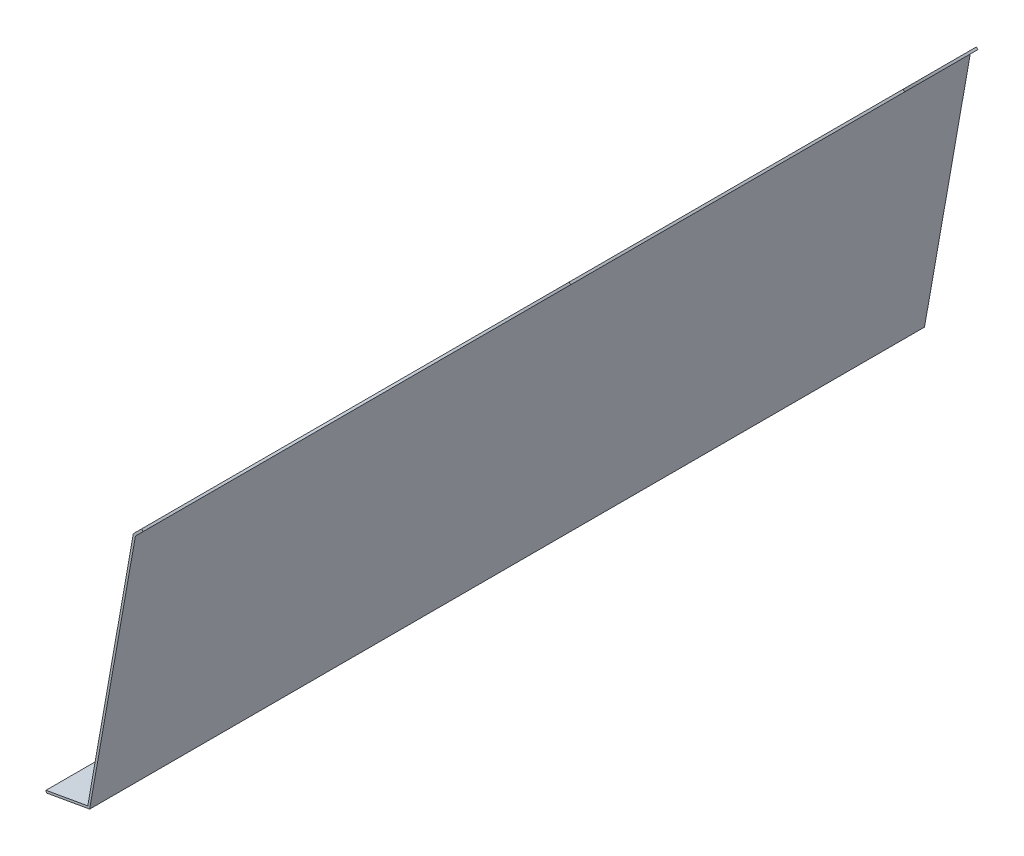
ISO-10303-21;
HEADER;
FILE_DESCRIPTION(('STEP AP214'),'2;1');
FILE_NAME('part.step','',(''),(''),'','','');
FILE_SCHEMA(('AUTOMOTIVE_DESIGN { 1 0 10303 214 1 1 1 1 }'));
ENDSEC;
DATA;
#1=APPLICATION_CONTEXT('core data for automotive mechanical design processes');
#2=APPLICATION_PROTOCOL_DEFINITION('international standard','automotive_design',2000,#1);
#3=PRODUCT_CONTEXT('',#1,'mechanical');
#4=PRODUCT('Part','Part','',(#3));
#5=PRODUCT_RELATED_PRODUCT_CATEGORY('part','',(#4));
#6=PRODUCT_DEFINITION_FORMATION('','',#4);
#7=PRODUCT_DEFINITION_CONTEXT('part definition',#1,'design');
#8=PRODUCT_DEFINITION('design','',#6,#7);
#9=PRODUCT_DEFINITION_SHAPE('','',#8);
#10=(LENGTH_UNIT() NAMED_UNIT(*) SI_UNIT(.MILLI.,.METRE.));
#11=(NAMED_UNIT(*) PLANE_ANGLE_UNIT() SI_UNIT($,.RADIAN.));
#12=(NAMED_UNIT(*) SI_UNIT($,.STERADIAN.) SOLID_ANGLE_UNIT());
#13=UNCERTAINTY_MEASURE_WITH_UNIT(LENGTH_MEASURE(1.E-05),#10,'distance_accuracy_value','');
#14=(GEOMETRIC_REPRESENTATION_CONTEXT(3) GLOBAL_UNCERTAINTY_ASSIGNED_CONTEXT((#13)) GLOBAL_UNIT_ASSIGNED_CONTEXT((#10,
#11,#12)) REPRESENTATION_CONTEXT('',''));
#15=CARTESIAN_POINT('',(0.,0.,0.));
#16=DIRECTION('',(0.,0.,1.));
#17=DIRECTION('',(1.,0.,0.));
#18=AXIS2_PLACEMENT_3D('',#15,#16,#17);
#19=CARTESIAN_POINT('',(-17.0348158316097,17.0348158316097,380.));
#20=DIRECTION('',(0.707106781186548,-0.707106781186548,0.));
#21=DIRECTION('',(0.707106781186548,0.707106781186548,0.));
#22=AXIS2_PLACEMENT_3D('',#19,#20,#21);
#23=PLANE('',#22);
#24=CARTESIAN_POINT('',(-72.5068070161094,-38.43717535289,254.5));
#25=DIRECTION('',(0.707106781186548,-0.707106781186547,0.));
#26=DIRECTION('',(0.707106781186547,0.707106781186548,0.));
#27=AXIS2_PLACEMENT_3D('',#24,#25,#26);
#28=CIRCLE('',#27,1.50000000000003);
#29=CARTESIAN_POINT('',(-71.4461468443295,-37.3765151811102,254.5));
#30=VERTEX_POINT('',#29);
#31=EDGE_CURVE('E183',#30,#30,#28,.T.);
#32=ORIENTED_EDGE('',*,*,#31,.F.);
#33=EDGE_LOOP('',(#32));
#34=FACE_BOUND('',#33,.T.);
#35=CARTESIAN_POINT('',(-80.992088390348,-46.9224567271286,254.5));
#36=DIRECTION('',(0.707106781186548,-0.707106781186547,0.));
#37=DIRECTION('',(0.707106781186547,0.707106781186548,0.));
#38=AXIS2_PLACEMENT_3D('',#35,#36,#37);
#39=CIRCLE('',#38,1.50000000000002);
#40=CARTESIAN_POINT('',(-79.9314282185681,-45.8617965553487,254.5));
#41=VERTEX_POINT('',#40);
#42=EDGE_CURVE('E173',#41,#41,#39,.T.);
#43=ORIENTED_EDGE('',*,*,#42,.F.);
#44=EDGE_LOOP('',(#43));
#45=FACE_BOUND('',#44,.T.);
#46=CARTESIAN_POINT('',(-72.5068070161094,-38.43717535289,125.5));
#47=DIRECTION('',(-0.707106781186548,0.707106781186547,0.));
#48=DIRECTION('',(-0.707106781186547,-0.707106781186548,0.));
#49=AXIS2_PLACEMENT_3D('',#46,#47,#48);
#50=CIRCLE('',#49,1.50000000000003);
#51=CARTESIAN_POINT('',(-73.5674671878892,-39.4978355246698,125.5));
#52=VERTEX_POINT('',#51);
#53=EDGE_CURVE('E167',#52,#52,#50,.T.);
#54=ORIENTED_EDGE('',*,*,#53,.T.);
#55=EDGE_LOOP('',(#54));
#56=FACE_BOUND('',#55,.T.);
#57=CARTESIAN_POINT('',(-44.2225357686475,-10.1529041054281,125.5));
#58=DIRECTION('',(-0.707106781186548,0.707106781186547,0.));
#59=DIRECTION('',(-0.707106781186547,-0.707106781186548,0.));
#60=AXIS2_PLACEMENT_3D('',#57,#58,#59);
#61=CIRCLE('',#60,1.50000000000002);
#62=CARTESIAN_POINT('',(-45.2831959404273,-11.2135642772079,125.5));
#63=VERTEX_POINT('',#62);
#64=EDGE_CURVE('E159',#63,#63,#61,.T.);
#65=ORIENTED_EDGE('',*,*,#64,.T.);
#66=EDGE_LOOP('',(#65));
#67=FACE_BOUND('',#66,.T.);
#68=CARTESIAN_POINT('',(-44.2225357686474,-10.1529041054281,254.5));
#69=DIRECTION('',(0.707106781186548,-0.707106781186547,0.));
#70=DIRECTION('',(0.707106781186547,0.707106781186548,0.));
#71=AXIS2_PLACEMENT_3D('',#68,#69,#70);
#72=CIRCLE('',#71,1.50000000000002);
#73=CARTESIAN_POINT('',(-43.1618755968676,-9.09224393364823,254.5));
#74=VERTEX_POINT('',#73);
#75=EDGE_CURVE('E151',#74,#74,#72,.T.);
#76=ORIENTED_EDGE('',*,*,#75,.F.);
#77=EDGE_LOOP('',(#76));
#78=FACE_BOUND('',#77,.T.);
#79=CARTESIAN_POINT('',(-52.7078171428861,-18.6381854796667,254.5));
#80=DIRECTION('',(0.707106781186548,-0.707106781186547,0.));
#81=DIRECTION('',(0.707106781186547,0.707106781186548,0.));
#82=AXIS2_PLACEMENT_3D('',#79,#80,#81);
#83=CIRCLE('',#82,1.50000000000002);
#84=CARTESIAN_POINT('',(-51.6471569711062,-17.5775253078868,254.5));
#85=VERTEX_POINT('',#84);
#86=EDGE_CURVE('E155',#85,#85,#83,.T.);
#87=ORIENTED_EDGE('',*,*,#86,.F.);
#88=EDGE_LOOP('',(#87));
#89=FACE_BOUND('',#88,.T.);
#90=DIRECTION('',(-0.707106781186548,-0.707106781186548,0.));
#91=VECTOR('',#90,1.);
#92=CARTESIAN_POINT('',(-17.0348158316097,17.0348158316097,0.));
#93=LINE('',#92,#91);
#94=CARTESIAN_POINT('',(-107.862146075437,-73.7925144122173,0.));
#95=VERTEX_POINT('',#94);
#96=CARTESIAN_POINT('',(-111.394108643907,-77.3244769806876,0.));
#97=VERTEX_POINT('',#96);
#98=EDGE_CURVE('E127',#95,#97,#93,.T.);
#99=ORIENTED_EDGE('',*,*,#98,.F.);
#100=CARTESIAN_POINT('',(-27.2519730201704,6.81765864304912,0.));
#101=DIRECTION('',(0.707106781186548,-0.707106781186547,0.));
#102=DIRECTION('',(0.707106781186547,0.707106781186548,0.));
#103=AXIS2_PLACEMENT_3D('',#100,#101,#102);
#104=CIRCLE('',#103,114.);
#105=CARTESIAN_POINT('',(-27.2519730201703,6.81765864304905,114.));
#106=VERTEX_POINT('',#105);
#107=EDGE_CURVE('E50',#95,#106,#104,.F.);
#108=ORIENTED_EDGE('',*,*,#107,.T.);
#109=DIRECTION('',(0.,0.,-1.));
#110=VECTOR('',#109,1.);
#111=CARTESIAN_POINT('',(-27.2519730201703,6.81765864304905,380.));
#112=LINE('',#111,#110);
#113=CARTESIAN_POINT('',(-27.2519730201703,6.81765864304905,266.));
#114=VERTEX_POINT('',#113);
#115=EDGE_CURVE('E125',#114,#106,#112,.T.);
#116=ORIENTED_EDGE('',*,*,#115,.F.);
#117=CARTESIAN_POINT('',(-27.2519730201704,6.81765864304912,380.));
#118=DIRECTION('',(0.707106781186548,-0.707106781186547,0.));
#119=DIRECTION('',(0.707106781186547,0.707106781186548,0.));
#120=AXIS2_PLACEMENT_3D('',#117,#118,#119);
#121=CIRCLE('',#120,114.);
#122=CARTESIAN_POINT('',(-107.862146075437,-73.7925144122174,380.));
#123=VERTEX_POINT('',#122);
#124=EDGE_CURVE('E194',#123,#114,#121,.T.);
#125=ORIENTED_EDGE('',*,*,#124,.F.);
#126=DIRECTION('',(-0.707106781186548,-0.707106781186548,0.));
#127=VECTOR('',#126,1.);
#128=CARTESIAN_POINT('',(-17.0348158316097,17.0348158316097,380.));
#129=LINE('',#128,#127);
#130=CARTESIAN_POINT('',(-111.394108643907,-77.3244769806876,380.));
#131=VERTEX_POINT('',#130);
#132=EDGE_CURVE('E213',#123,#131,#129,.T.);
#133=ORIENTED_EDGE('',*,*,#132,.T.);
#134=DIRECTION('',(0.,0.,-1.));
#135=VECTOR('',#134,1.);
#136=CARTESIAN_POINT('',(-111.394108643907,-77.3244769806876,380.));
#137=LINE('',#136,#135);
#138=EDGE_CURVE('E132',#131,#97,#137,.T.);
#139=ORIENTED_EDGE('',*,*,#138,.T.);
#140=EDGE_LOOP('',(#99,#108,#116,#125,#133,#139));
#141=FACE_BOUND('',#140,.T.);
#142=CARTESIAN_POINT('',(-52.7078171428861,-18.6381854796666,125.5));
#143=DIRECTION('',(-0.707106781186548,0.707106781186547,0.));
#144=DIRECTION('',(-0.707106781186547,-0.707106781186548,0.));
#145=AXIS2_PLACEMENT_3D('',#142,#143,#144);
#146=CIRCLE('',#145,1.50000000000002);
#147=CARTESIAN_POINT('',(-53.7684773146659,-19.6988456514465,125.5));
#148=VERTEX_POINT('',#147);
#149=EDGE_CURVE('E163',#148,#148,#146,.T.);
#150=ORIENTED_EDGE('',*,*,#149,.T.);
#151=EDGE_LOOP('',(#150));
#152=FACE_BOUND('',#151,.T.);
#153=CARTESIAN_POINT('',(-80.9920883903479,-46.9224567271286,125.5));
#154=DIRECTION('',(-0.707106781186548,0.707106781186547,0.));
#155=DIRECTION('',(-0.707106781186547,-0.707106781186548,0.));
#156=AXIS2_PLACEMENT_3D('',#153,#154,#155);
#157=CIRCLE('',#156,1.50000000000003);
#158=CARTESIAN_POINT('',(-82.0527485621278,-47.9831168989084,125.5));
#159=VERTEX_POINT('',#158);
#160=EDGE_CURVE('E170',#159,#159,#157,.T.);
#161=ORIENTED_EDGE('',*,*,#160,.T.);
#162=EDGE_LOOP('',(#161));
#163=FACE_BOUND('',#162,.T.);
#164=ADVANCED_FACE('F34',(#34,#45,#56,#67,#78,#89,#141,#152,#163),#23,.T.);
#165=CARTESIAN_POINT('',(-17.7419226127962,17.7419226127962,380.));
#166=DIRECTION('',(0.707106781186548,-0.707106781186548,0.));
#167=DIRECTION('',(0.707106781186548,0.707106781186548,0.));
#168=AXIS2_PLACEMENT_3D('',#165,#166,#167);
#169=PLANE('',#168);
#170=CARTESIAN_POINT('',(-73.2139137972959,-37.7300685717034,254.5));
#171=DIRECTION('',(0.707106781186548,-0.707106781186548,0.));
#172=DIRECTION('',(0.707106781186548,0.707106781186548,0.));
#173=AXIS2_PLACEMENT_3D('',#170,#171,#172);
#174=CIRCLE('',#173,1.50000000000003);
#175=CARTESIAN_POINT('',(-72.1532536255161,-36.6694083999236,254.5));
#176=VERTEX_POINT('',#175);
#177=EDGE_CURVE('E38',#176,#176,#174,.T.);
#178=ORIENTED_EDGE('',*,*,#177,.T.);
#179=EDGE_LOOP('',(#178));
#180=FACE_BOUND('',#179,.T.);
#181=CARTESIAN_POINT('',(-81.6991951715345,-46.215349945942,254.5));
#182=DIRECTION('',(0.707106781186548,-0.707106781186548,0.));
#183=DIRECTION('',(0.707106781186548,0.707106781186548,0.));
#184=AXIS2_PLACEMENT_3D('',#181,#182,#183);
#185=CIRCLE('',#184,1.50000000000002);
#186=CARTESIAN_POINT('',(-80.6385349997547,-45.1546897741622,254.5));
#187=VERTEX_POINT('',#186);
#188=EDGE_CURVE('E171',#187,#187,#185,.T.);
#189=ORIENTED_EDGE('',*,*,#188,.T.);
#190=EDGE_LOOP('',(#189));
#191=FACE_BOUND('',#190,.T.);
#192=CARTESIAN_POINT('',(-73.2139137972959,-37.7300685717034,125.5));
#193=DIRECTION('',(0.707106781186548,-0.707106781186548,0.));
#194=DIRECTION('',(0.707106781186548,0.707106781186548,0.));
#195=AXIS2_PLACEMENT_3D('',#192,#193,#194);
#196=CIRCLE('',#195,1.50000000000003);
#197=CARTESIAN_POINT('',(-72.1532536255161,-36.6694083999236,125.5));
#198=VERTEX_POINT('',#197);
#199=EDGE_CURVE('E164',#198,#198,#196,.F.);
#200=ORIENTED_EDGE('',*,*,#199,.F.);
#201=EDGE_LOOP('',(#200));
#202=FACE_BOUND('',#201,.T.);
#203=CARTESIAN_POINT('',(-44.929642549834,-9.44579732424153,125.5));
#204=DIRECTION('',(0.707106781186548,-0.707106781186548,0.));
#205=DIRECTION('',(0.707106781186548,0.707106781186548,0.));
#206=AXIS2_PLACEMENT_3D('',#203,#204,#205);
#207=CIRCLE('',#206,1.50000000000002);
#208=CARTESIAN_POINT('',(-43.8689823780542,-8.3851371524617,125.5));
#209=VERTEX_POINT('',#208);
#210=EDGE_CURVE('E118',#209,#209,#207,.F.);
#211=ORIENTED_EDGE('',*,*,#210,.F.);
#212=EDGE_LOOP('',(#211));
#213=FACE_BOUND('',#212,.T.);
#214=CARTESIAN_POINT('',(-44.929642549834,-9.4457973242415,254.5));
#215=DIRECTION('',(0.707106781186548,-0.707106781186548,0.));
#216=DIRECTION('',(0.707106781186548,0.707106781186548,0.));
#217=AXIS2_PLACEMENT_3D('',#214,#215,#216);
#218=CIRCLE('',#217,1.50000000000002);
#219=CARTESIAN_POINT('',(-43.8689823780542,-8.38513715246166,254.5));
#220=VERTEX_POINT('',#219);
#221=EDGE_CURVE('E147',#220,#220,#218,.T.);
#222=ORIENTED_EDGE('',*,*,#221,.T.);
#223=EDGE_LOOP('',(#222));
#224=FACE_BOUND('',#223,.T.);
#225=CARTESIAN_POINT('',(-53.4149239240726,-17.9310786984801,254.5));
#226=DIRECTION('',(0.707106781186548,-0.707106781186548,0.));
#227=DIRECTION('',(0.707106781186548,0.707106781186548,0.));
#228=AXIS2_PLACEMENT_3D('',#225,#226,#227);
#229=CIRCLE('',#228,1.50000000000002);
#230=CARTESIAN_POINT('',(-52.3542637522928,-16.8704185267003,254.5));
#231=VERTEX_POINT('',#230);
#232=EDGE_CURVE('E152',#231,#231,#229,.T.);
#233=ORIENTED_EDGE('',*,*,#232,.T.);
#234=EDGE_LOOP('',(#233));
#235=FACE_BOUND('',#234,.T.);
#236=CARTESIAN_POINT('',(-27.9590798013569,7.52476542423563,0.));
#237=DIRECTION('',(0.707106781186548,-0.707106781186548,0.));
#238=DIRECTION('',(0.707106781186548,0.707106781186548,0.));
#239=AXIS2_PLACEMENT_3D('',#236,#237,#238);
#240=CIRCLE('',#239,114.);
#241=CARTESIAN_POINT('',(-108.569252856623,-73.0854076310307,0.));
#242=VERTEX_POINT('',#241);
#243=CARTESIAN_POINT('',(-27.9590798013569,7.5247654242356,114.));
#244=VERTEX_POINT('',#243);
#245=EDGE_CURVE('E113',#242,#244,#240,.F.);
#246=ORIENTED_EDGE('',*,*,#245,.F.);
#247=DIRECTION('',(-0.707106781186548,-0.707106781186548,0.));
#248=VECTOR('',#247,1.);
#249=CARTESIAN_POINT('',(-17.7419226127962,17.7419226127962,0.));
#250=LINE('',#249,#248);
#251=CARTESIAN_POINT('',(-112.32416533681,-76.8403201112173,0.));
#252=VERTEX_POINT('',#251);
#253=EDGE_CURVE('E232',#242,#252,#250,.T.);
#254=ORIENTED_EDGE('',*,*,#253,.T.);
#255=DIRECTION('',(0.,0.,-1.));
#256=VECTOR('',#255,1.);
#257=CARTESIAN_POINT('',(-112.32416533681,-76.8403201112173,380.));
#258=LINE('',#257,#256);
#259=CARTESIAN_POINT('',(-112.32416533681,-76.8403201112173,380.));
#260=VERTEX_POINT('',#259);
#261=EDGE_CURVE('E137',#260,#252,#258,.T.);
#262=ORIENTED_EDGE('',*,*,#261,.F.);
#263=DIRECTION('',(-0.707106781186548,-0.707106781186548,0.));
#264=VECTOR('',#263,1.);
#265=CARTESIAN_POINT('',(-17.7419226127962,17.7419226127962,380.));
#266=LINE('',#265,#264);
#267=CARTESIAN_POINT('',(-108.569252856623,-73.0854076310308,380.));
#268=VERTEX_POINT('',#267);
#269=EDGE_CURVE('E215',#268,#260,#266,.T.);
#270=ORIENTED_EDGE('',*,*,#269,.F.);
#271=CARTESIAN_POINT('',(-27.9590798013569,7.52476542423563,380.));
#272=DIRECTION('',(0.707106781186548,-0.707106781186548,0.));
#273=DIRECTION('',(0.707106781186548,0.707106781186548,0.));
#274=AXIS2_PLACEMENT_3D('',#271,#272,#273);
#275=CIRCLE('',#274,114.);
#276=CARTESIAN_POINT('',(-27.9590798013569,7.5247654242356,266.));
#277=VERTEX_POINT('',#276);
#278=EDGE_CURVE('E58',#268,#277,#275,.T.);
#279=ORIENTED_EDGE('',*,*,#278,.T.);
#280=DIRECTION('',(0.,0.,-1.));
#281=VECTOR('',#280,1.);
#282=CARTESIAN_POINT('',(-27.9590798013569,7.5247654242356,380.));
#283=LINE('',#282,#281);
#284=EDGE_CURVE('E133',#277,#244,#283,.T.);
#285=ORIENTED_EDGE('',*,*,#284,.T.);
#286=EDGE_LOOP('',(#246,#254,#262,#270,#279,#285));
#287=FACE_BOUND('',#286,.T.);
#288=CARTESIAN_POINT('',(-53.4149239240726,-17.9310786984801,125.5));
#289=DIRECTION('',(0.707106781186548,-0.707106781186548,0.));
#290=DIRECTION('',(0.707106781186548,0.707106781186548,0.));
#291=AXIS2_PLACEMENT_3D('',#288,#289,#290);
#292=CIRCLE('',#291,1.50000000000002);
#293=CARTESIAN_POINT('',(-52.3542637522928,-16.8704185267003,125.5));
#294=VERTEX_POINT('',#293);
#295=EDGE_CURVE('E160',#294,#294,#292,.F.);
#296=ORIENTED_EDGE('',*,*,#295,.F.);
#297=EDGE_LOOP('',(#296));
#298=FACE_BOUND('',#297,.T.);
#299=CARTESIAN_POINT('',(-81.6991951715345,-46.215349945942,125.5));
#300=DIRECTION('',(0.707106781186548,-0.707106781186548,0.));
#301=DIRECTION('',(0.707106781186548,0.707106781186548,0.));
#302=AXIS2_PLACEMENT_3D('',#299,#300,#301);
#303=CIRCLE('',#302,1.50000000000003);
#304=CARTESIAN_POINT('',(-80.6385349997547,-45.1546897741622,125.5));
#305=VERTEX_POINT('',#304);
#306=EDGE_CURVE('E168',#305,#305,#303,.F.);
#307=ORIENTED_EDGE('',*,*,#306,.F.);
#308=EDGE_LOOP('',(#307));
#309=FACE_BOUND('',#308,.T.);
#310=ADVANCED_FACE('F257',(#180,#191,#202,#213,#224,#235,#287,#298,#309),#169,.F.);
#311=CARTESIAN_POINT('',(-10.2171571885606,-10.2171571885606,380.));
#312=DIRECTION('',(0.707106781186547,0.707106781186548,0.));
#313=DIRECTION('',(-0.707106781186548,0.707106781186547,0.));
#314=AXIS2_PLACEMENT_3D('',#311,#312,#313);
#315=PLANE('',#314);
#316=ORIENTED_EDGE('',*,*,#115,.T.);
#317=DIRECTION('',(0.707106781186548,-0.707106781186547,0.));
#318=VECTOR('',#317,1.);
#319=CARTESIAN_POINT('',(-29.37329336373,8.93897898660869,114.));
#320=LINE('',#319,#318);
#321=EDGE_CURVE('E110',#244,#106,#320,.T.);
#322=ORIENTED_EDGE('',*,*,#321,.F.);
#323=ORIENTED_EDGE('',*,*,#284,.F.);
#324=DIRECTION('',(0.707106781186548,-0.707106781186547,0.));
#325=VECTOR('',#324,1.);
#326=CARTESIAN_POINT('',(-29.37329336373,8.93897898660869,266.));
#327=LINE('',#326,#325);
#328=EDGE_CURVE('E131',#277,#114,#327,.T.);
#329=ORIENTED_EDGE('',*,*,#328,.T.);
#330=EDGE_LOOP('',(#316,#322,#323,#329));
#331=FACE_BOUND('',#330,.T.);
#332=ADVANCED_FACE('F130',(#331),#315,.T.);
#333=CARTESIAN_POINT('',(0.,0.,0.));
#334=DIRECTION('',(0.,0.,1.));
#335=DIRECTION('',(1.,0.,0.));
#336=AXIS2_PLACEMENT_3D('',#333,#334,#335);
#337=PLANE('',#336);
#338=DIRECTION('',(0.707106781186548,-0.707106781186547,0.));
#339=VECTOR('',#338,1.);
#340=CARTESIAN_POINT('',(-109.983466418996,-71.6711940686577,0.));
#341=LINE('',#340,#339);
#342=EDGE_CURVE('E11',#95,#242,#341,.F.);
#343=ORIENTED_EDGE('',*,*,#342,.F.);
#344=ORIENTED_EDGE('',*,*,#98,.T.);
#345=DIRECTION('',(-0.173648177666927,-0.984807753012209,0.));
#346=VECTOR('',#345,1.);
#347=CARTESIAN_POINT('',(-94.8119009180469,16.717896224109,0.));
#348=LINE('',#347,#346);
#349=CARTESIAN_POINT('',(-132.211708421142,-195.386952125401,0.));
#350=VERTEX_POINT('',#349);
#351=EDGE_CURVE('E228',#97,#350,#348,.T.);
#352=ORIENTED_EDGE('',*,*,#351,.T.);
#353=DIRECTION('',(-0.984807753012209,-0.173648177666925,0.));
#354=VECTOR('',#353,1.);
#355=CARTESIAN_POINT('',(29.4264658667985,-166.885780885981,0.));
#356=LINE('',#355,#354);
#357=CARTESIAN_POINT('',(-151.907863481386,-198.859915678739,0.));
#358=VERTEX_POINT('',#357);
#359=EDGE_CURVE('E225',#350,#358,#356,.T.);
#360=ORIENTED_EDGE('',*,*,#359,.T.);
#361=DIRECTION('',(0.173648177666934,-0.984807753012207,0.));
#362=VECTOR('',#361,1.);
#363=CARTESIAN_POINT('',(-181.334329348185,-31.9741347927607,0.));
#364=LINE('',#363,#362);
#365=CARTESIAN_POINT('',(-152.081511659052,-197.875107925727,0.));
#366=VERTEX_POINT('',#365);
#367=EDGE_CURVE('E222',#366,#358,#364,.T.);
#368=ORIENTED_EDGE('',*,*,#367,.F.);
#369=DIRECTION('',(-0.984807753012209,-0.173648177666924,0.));
#370=VECTOR('',#369,1.);
#371=CARTESIAN_POINT('',(29.2528176891314,-165.900973132969,0.));
#372=LINE('',#371,#370);
#373=CARTESIAN_POINT('',(-133.074926411155,-194.523734135388,0.));
#374=VERTEX_POINT('',#373);
#375=EDGE_CURVE('E150',#374,#366,#372,.T.);
#376=ORIENTED_EDGE('',*,*,#375,.F.);
#377=DIRECTION('',(-0.173648177666927,-0.984807753012209,0.));
#378=VECTOR('',#377,1.);
#379=CARTESIAN_POINT('',(-95.7967086710591,16.8915444017759,0.));
#380=LINE('',#379,#378);
#381=EDGE_CURVE('E205',#252,#374,#380,.T.);
#382=ORIENTED_EDGE('',*,*,#381,.F.);
#383=ORIENTED_EDGE('',*,*,#253,.F.);
#384=EDGE_LOOP('',(#343,#344,#352,#360,#368,#376,#382,#383));
#385=FACE_BOUND('',#384,.T.);
#386=ADVANCED_FACE('F248',(#385),#337,.F.);
#387=CARTESIAN_POINT('',(29.2528176891314,-165.900973132969,380.));
#388=DIRECTION('',(0.173648177666924,-0.984807753012209,0.));
#389=DIRECTION('',(0.984807753012209,0.173648177666924,0.));
#390=AXIS2_PLACEMENT_3D('',#387,#388,#389);
#391=PLANE('',#390);
#392=ORIENTED_EDGE('',*,*,#375,.T.);
#393=DIRECTION('',(0.,0.,-1.));
#394=VECTOR('',#393,1.);
#395=CARTESIAN_POINT('',(-152.081511659052,-197.875107925727,380.));
#396=LINE('',#395,#394);
#397=CARTESIAN_POINT('',(-152.081511659052,-197.875107925727,380.));
#398=VERTEX_POINT('',#397);
#399=EDGE_CURVE('E144',#398,#366,#396,.T.);
#400=ORIENTED_EDGE('',*,*,#399,.F.);
#401=DIRECTION('',(-0.984807753012209,-0.173648177666924,0.));
#402=VECTOR('',#401,1.);
#403=CARTESIAN_POINT('',(29.2528176891314,-165.900973132969,380.));
#404=LINE('',#403,#402);
#405=CARTESIAN_POINT('',(-133.074926411155,-194.523734135388,380.));
#406=VERTEX_POINT('',#405);
#407=EDGE_CURVE('E201',#406,#398,#404,.T.);
#408=ORIENTED_EDGE('',*,*,#407,.F.);
#409=DIRECTION('',(0.,0.,-1.));
#410=VECTOR('',#409,1.);
#411=CARTESIAN_POINT('',(-133.074926411155,-194.523734135388,380.));
#412=LINE('',#411,#410);
#413=EDGE_CURVE('E219',#406,#374,#412,.T.);
#414=ORIENTED_EDGE('',*,*,#413,.T.);
#415=EDGE_LOOP('',(#392,#400,#408,#414));
#416=FACE_BOUND('',#415,.T.);
#417=ADVANCED_FACE('F36',(#416),#391,.F.);
#418=CARTESIAN_POINT('',(-181.334329348185,-31.9741347927607,380.));
#419=DIRECTION('',(0.984807753012207,0.173648177666934,0.));
#420=DIRECTION('',(-0.173648177666934,0.984807753012207,0.));
#421=AXIS2_PLACEMENT_3D('',#418,#419,#420);
#422=PLANE('',#421);
#423=ORIENTED_EDGE('',*,*,#367,.T.);
#424=DIRECTION('',(0.,0.,-1.));
#425=VECTOR('',#424,1.);
#426=CARTESIAN_POINT('',(-151.907863481386,-198.859915678739,380.));
#427=LINE('',#426,#425);
#428=CARTESIAN_POINT('',(-151.907863481386,-198.859915678739,380.));
#429=VERTEX_POINT('',#428);
#430=EDGE_CURVE('E142',#429,#358,#427,.T.);
#431=ORIENTED_EDGE('',*,*,#430,.F.);
#432=DIRECTION('',(0.173648177666934,-0.984807753012207,0.));
#433=VECTOR('',#432,1.);
#434=CARTESIAN_POINT('',(-181.334329348185,-31.9741347927607,380.));
#435=LINE('',#434,#433);
#436=EDGE_CURVE('E204',#398,#429,#435,.T.);
#437=ORIENTED_EDGE('',*,*,#436,.F.);
#438=ORIENTED_EDGE('',*,*,#399,.T.);
#439=EDGE_LOOP('',(#423,#431,#437,#438));
#440=FACE_BOUND('',#439,.T.);
#441=ADVANCED_FACE('F297',(#440),#422,.F.);
#442=CARTESIAN_POINT('',(29.4264658667985,-166.885780885981,380.));
#443=DIRECTION('',(0.173648177666925,-0.984807753012209,0.));
#444=DIRECTION('',(0.984807753012209,0.173648177666925,0.));
#445=AXIS2_PLACEMENT_3D('',#442,#443,#444);
#446=PLANE('',#445);
#447=ORIENTED_EDGE('',*,*,#359,.F.);
#448=DIRECTION('',(0.,0.,-1.));
#449=VECTOR('',#448,1.);
#450=CARTESIAN_POINT('',(-132.211708421142,-195.386952125401,380.));
#451=LINE('',#450,#449);
#452=CARTESIAN_POINT('',(-132.211708421142,-195.386952125401,380.));
#453=VERTEX_POINT('',#452);
#454=EDGE_CURVE('E135',#453,#350,#451,.T.);
#455=ORIENTED_EDGE('',*,*,#454,.F.);
#456=DIRECTION('',(-0.984807753012209,-0.173648177666925,0.));
#457=VECTOR('',#456,1.);
#458=CARTESIAN_POINT('',(29.4264658667985,-166.885780885981,380.));
#459=LINE('',#458,#457);
#460=EDGE_CURVE('E207',#453,#429,#459,.T.);
#461=ORIENTED_EDGE('',*,*,#460,.T.);
#462=ORIENTED_EDGE('',*,*,#430,.T.);
#463=EDGE_LOOP('',(#447,#455,#461,#462));
#464=FACE_BOUND('',#463,.T.);
#465=ADVANCED_FACE('F294',(#464),#446,.T.);
#466=CARTESIAN_POINT('',(-94.8119009180469,16.717896224109,380.));
#467=DIRECTION('',(0.984807753012209,-0.173648177666927,0.));
#468=DIRECTION('',(0.173648177666927,0.984807753012209,0.));
#469=AXIS2_PLACEMENT_3D('',#466,#467,#468);
#470=PLANE('',#469);
#471=ORIENTED_EDGE('',*,*,#351,.F.);
#472=ORIENTED_EDGE('',*,*,#138,.F.);
#473=DIRECTION('',(-0.173648177666927,-0.984807753012209,0.));
#474=VECTOR('',#473,1.);
#475=CARTESIAN_POINT('',(-94.8119009180469,16.717896224109,380.));
#476=LINE('',#475,#474);
#477=EDGE_CURVE('E210',#131,#453,#476,.T.);
#478=ORIENTED_EDGE('',*,*,#477,.T.);
#479=ORIENTED_EDGE('',*,*,#454,.T.);
#480=EDGE_LOOP('',(#471,#472,#478,#479));
#481=FACE_BOUND('',#480,.T.);
#482=ADVANCED_FACE('F291',(#481),#470,.T.);
#483=CARTESIAN_POINT('',(-95.7967086710591,16.8915444017759,380.));
#484=DIRECTION('',(0.984807753012209,-0.173648177666927,0.));
#485=DIRECTION('',(0.173648177666927,0.984807753012209,0.));
#486=AXIS2_PLACEMENT_3D('',#483,#484,#485);
#487=PLANE('',#486);
#488=ORIENTED_EDGE('',*,*,#381,.T.);
#489=ORIENTED_EDGE('',*,*,#413,.F.);
#490=DIRECTION('',(-0.173648177666927,-0.984807753012209,0.));
#491=VECTOR('',#490,1.);
#492=CARTESIAN_POINT('',(-95.7967086710591,16.8915444017759,380.));
#493=LINE('',#492,#491);
#494=EDGE_CURVE('E217',#260,#406,#493,.T.);
#495=ORIENTED_EDGE('',*,*,#494,.F.);
#496=ORIENTED_EDGE('',*,*,#261,.T.);
#497=EDGE_LOOP('',(#488,#489,#495,#496));
#498=FACE_BOUND('',#497,.T.);
#499=ADVANCED_FACE('F241',(#498),#487,.F.);
#500=CARTESIAN_POINT('',(0.,0.,380.));
#501=DIRECTION('',(0.,0.,1.));
#502=DIRECTION('',(1.,0.,0.));
#503=AXIS2_PLACEMENT_3D('',#500,#501,#502);
#504=PLANE('',#503);
#505=DIRECTION('',(0.707106781186548,-0.707106781186547,0.));
#506=VECTOR('',#505,1.);
#507=CARTESIAN_POINT('',(-109.983466418996,-71.6711940686577,380.));
#508=LINE('',#507,#506);
#509=EDGE_CURVE('E43',#268,#123,#508,.T.);
#510=ORIENTED_EDGE('',*,*,#509,.F.);
#511=ORIENTED_EDGE('',*,*,#269,.T.);
#512=ORIENTED_EDGE('',*,*,#494,.T.);
#513=ORIENTED_EDGE('',*,*,#407,.T.);
#514=ORIENTED_EDGE('',*,*,#436,.T.);
#515=ORIENTED_EDGE('',*,*,#460,.F.);
#516=ORIENTED_EDGE('',*,*,#477,.F.);
#517=ORIENTED_EDGE('',*,*,#132,.F.);
#518=EDGE_LOOP('',(#510,#511,#512,#513,#514,#515,#516,#517));
#519=FACE_BOUND('',#518,.T.);
#520=ADVANCED_FACE('F253',(#519),#504,.T.);
#521=CARTESIAN_POINT('',(-46.3438561122071,-8.03158376186843,254.5));
#522=DIRECTION('',(0.707106781186548,-0.707106781186547,0.));
#523=DIRECTION('',(0.707106781186547,0.707106781186548,0.));
#524=AXIS2_PLACEMENT_3D('',#521,#522,#523);
#525=CYLINDRICAL_SURFACE('',#524,1.50000000000002);
#526=ORIENTED_EDGE('',*,*,#75,.T.);
#527=EDGE_LOOP('',(#526));
#528=FACE_BOUND('',#527,.T.);
#529=ORIENTED_EDGE('',*,*,#221,.F.);
#530=EDGE_LOOP('',(#529));
#531=FACE_BOUND('',#530,.T.);
#532=ADVANCED_FACE('F318',(#528,#531),#525,.F.);
#533=CARTESIAN_POINT('',(-54.8291374864457,-16.516865136107,254.5));
#534=DIRECTION('',(0.707106781186548,-0.707106781186547,0.));
#535=DIRECTION('',(0.707106781186547,0.707106781186548,0.));
#536=AXIS2_PLACEMENT_3D('',#533,#534,#535);
#537=CYLINDRICAL_SURFACE('',#536,1.50000000000002);
#538=ORIENTED_EDGE('',*,*,#86,.T.);
#539=EDGE_LOOP('',(#538));
#540=FACE_BOUND('',#539,.T.);
#541=ORIENTED_EDGE('',*,*,#232,.F.);
#542=EDGE_LOOP('',(#541));
#543=FACE_BOUND('',#542,.T.);
#544=ADVANCED_FACE('F310',(#540,#543),#537,.F.);
#545=CARTESIAN_POINT('',(-29.37329336373,8.93897898660876,380.));
#546=DIRECTION('',(0.707106781186548,-0.707106781186547,0.));
#547=DIRECTION('',(0.707106781186547,0.707106781186548,0.));
#548=AXIS2_PLACEMENT_3D('',#545,#546,#547);
#549=CYLINDRICAL_SURFACE('',#548,114.);
#550=ORIENTED_EDGE('',*,*,#509,.T.);
#551=ORIENTED_EDGE('',*,*,#124,.T.);
#552=ORIENTED_EDGE('',*,*,#328,.F.);
#553=ORIENTED_EDGE('',*,*,#278,.F.);
#554=EDGE_LOOP('',(#550,#551,#552,#553));
#555=FACE_BOUND('',#554,.T.);
#556=ADVANCED_FACE('F308',(#555),#549,.F.);
#557=CARTESIAN_POINT('',(-29.37329336373,8.93897898660876,0.));
#558=DIRECTION('',(0.707106781186548,-0.707106781186547,0.));
#559=DIRECTION('',(0.707106781186547,0.707106781186548,0.));
#560=AXIS2_PLACEMENT_3D('',#557,#558,#559);
#561=CYLINDRICAL_SURFACE('',#560,114.);
#562=ORIENTED_EDGE('',*,*,#245,.T.);
#563=ORIENTED_EDGE('',*,*,#321,.T.);
#564=ORIENTED_EDGE('',*,*,#107,.F.);
#565=ORIENTED_EDGE('',*,*,#342,.T.);
#566=EDGE_LOOP('',(#562,#563,#564,#565));
#567=FACE_BOUND('',#566,.T.);
#568=ADVANCED_FACE('F111',(#567),#561,.F.);
#569=CARTESIAN_POINT('',(-46.3438561122071,-8.03158376186843,125.5));
#570=DIRECTION('',(0.707106781186548,-0.707106781186547,0.));
#571=DIRECTION('',(0.707106781186547,0.707106781186548,0.));
#572=AXIS2_PLACEMENT_3D('',#569,#570,#571);
#573=CYLINDRICAL_SURFACE('',#572,1.50000000000002);
#574=ORIENTED_EDGE('',*,*,#64,.F.);
#575=EDGE_LOOP('',(#574));
#576=FACE_BOUND('',#575,.T.);
#577=ORIENTED_EDGE('',*,*,#210,.T.);
#578=EDGE_LOOP('',(#577));
#579=FACE_BOUND('',#578,.T.);
#580=ADVANCED_FACE('F316',(#576,#579),#573,.F.);
#581=CARTESIAN_POINT('',(-54.8291374864457,-16.516865136107,125.5));
#582=DIRECTION('',(0.707106781186548,-0.707106781186547,0.));
#583=DIRECTION('',(0.707106781186547,0.707106781186548,0.));
#584=AXIS2_PLACEMENT_3D('',#581,#582,#583);
#585=CYLINDRICAL_SURFACE('',#584,1.50000000000002);
#586=ORIENTED_EDGE('',*,*,#149,.F.);
#587=EDGE_LOOP('',(#586));
#588=FACE_BOUND('',#587,.T.);
#589=ORIENTED_EDGE('',*,*,#295,.T.);
#590=EDGE_LOOP('',(#589));
#591=FACE_BOUND('',#590,.T.);
#592=ADVANCED_FACE('F278',(#588,#591),#585,.F.);
#593=CARTESIAN_POINT('',(-74.628127359669,-36.3158550093303,125.5));
#594=DIRECTION('',(0.707106781186548,-0.707106781186547,0.));
#595=DIRECTION('',(0.707106781186547,0.707106781186548,0.));
#596=AXIS2_PLACEMENT_3D('',#593,#594,#595);
#597=CYLINDRICAL_SURFACE('',#596,1.50000000000003);
#598=ORIENTED_EDGE('',*,*,#53,.F.);
#599=EDGE_LOOP('',(#598));
#600=FACE_BOUND('',#599,.T.);
#601=ORIENTED_EDGE('',*,*,#199,.T.);
#602=EDGE_LOOP('',(#601));
#603=FACE_BOUND('',#602,.T.);
#604=ADVANCED_FACE('F269',(#600,#603),#597,.F.);
#605=CARTESIAN_POINT('',(-83.1134087339076,-44.8011363835689,125.5));
#606=DIRECTION('',(0.707106781186548,-0.707106781186547,0.));
#607=DIRECTION('',(0.707106781186547,0.707106781186548,0.));
#608=AXIS2_PLACEMENT_3D('',#605,#606,#607);
#609=CYLINDRICAL_SURFACE('',#608,1.50000000000003);
#610=ORIENTED_EDGE('',*,*,#160,.F.);
#611=EDGE_LOOP('',(#610));
#612=FACE_BOUND('',#611,.T.);
#613=ORIENTED_EDGE('',*,*,#306,.T.);
#614=EDGE_LOOP('',(#613));
#615=FACE_BOUND('',#614,.T.);
#616=ADVANCED_FACE('F266',(#612,#615),#609,.F.);
#617=CARTESIAN_POINT('',(-83.1134087339076,-44.8011363835689,254.5));
#618=DIRECTION('',(0.707106781186548,-0.707106781186547,0.));
#619=DIRECTION('',(0.707106781186547,0.707106781186548,0.));
#620=AXIS2_PLACEMENT_3D('',#617,#618,#619);
#621=CYLINDRICAL_SURFACE('',#620,1.50000000000002);
#622=ORIENTED_EDGE('',*,*,#42,.T.);
#623=EDGE_LOOP('',(#622));
#624=FACE_BOUND('',#623,.T.);
#625=ORIENTED_EDGE('',*,*,#188,.F.);
#626=EDGE_LOOP('',(#625));
#627=FACE_BOUND('',#626,.T.);
#628=ADVANCED_FACE('F268',(#624,#627),#621,.F.);
#629=CARTESIAN_POINT('',(-74.628127359669,-36.3158550093303,254.5));
#630=DIRECTION('',(0.707106781186548,-0.707106781186547,0.));
#631=DIRECTION('',(0.707106781186547,0.707106781186548,0.));
#632=AXIS2_PLACEMENT_3D('',#629,#630,#631);
#633=CYLINDRICAL_SURFACE('',#632,1.50000000000003);
#634=ORIENTED_EDGE('',*,*,#31,.T.);
#635=EDGE_LOOP('',(#634));
#636=FACE_BOUND('',#635,.T.);
#637=ORIENTED_EDGE('',*,*,#177,.F.);
#638=EDGE_LOOP('',(#637));
#639=FACE_BOUND('',#638,.T.);
#640=ADVANCED_FACE('F276',(#636,#639),#633,.F.);
#641=CLOSED_SHELL('',(#164,#310,#332,#386,#417,#441,#465,#482,#499,#520,#532,#544,#556,#568,
#580,#592,#604,#616,#628,#640));
#642=MANIFOLD_SOLID_BREP('B2',#641);
#643=ADVANCED_BREP_SHAPE_REPRESENTATION('',(#18,#642),#14);
#644=SHAPE_DEFINITION_REPRESENTATION(#9,#643);
ENDSEC;
END-ISO-10303-21;
